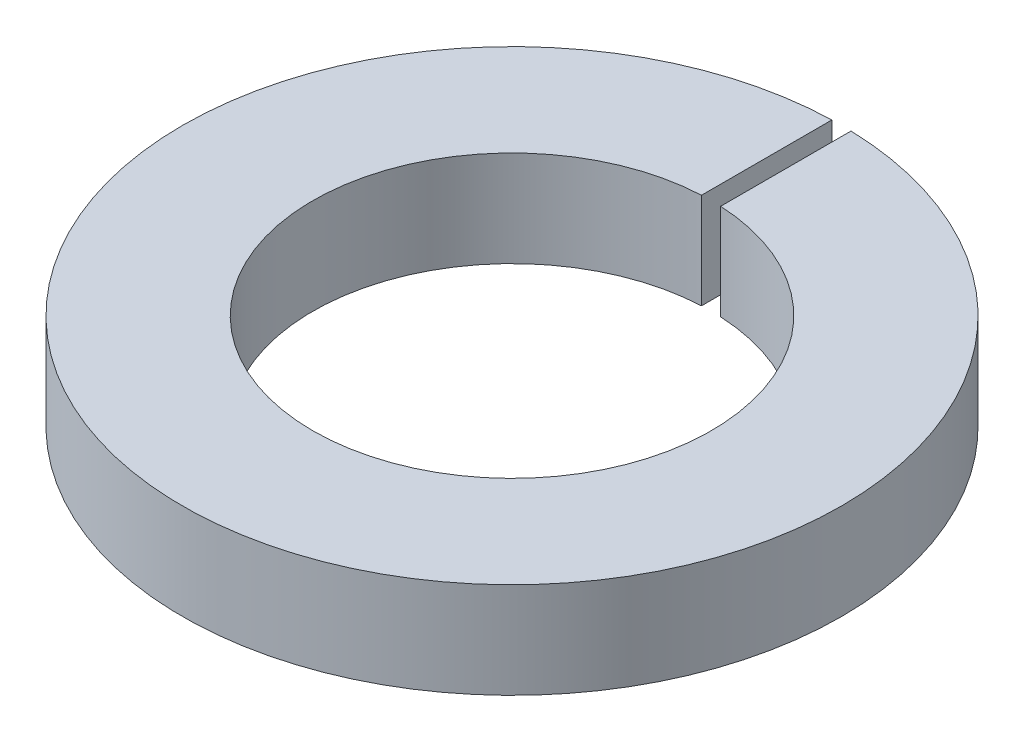
ISO-10303-21;
HEADER;
FILE_DESCRIPTION(('STEP AP214'),'2;1');
FILE_NAME('part.step','',(''),(''),'','','');
FILE_SCHEMA(('AUTOMOTIVE_DESIGN { 1 0 10303 214 1 1 1 1 }'));
ENDSEC;
DATA;
#1=APPLICATION_CONTEXT('core data for automotive mechanical design processes');
#2=APPLICATION_PROTOCOL_DEFINITION('international standard','automotive_design',2000,#1);
#3=PRODUCT_CONTEXT('',#1,'mechanical');
#4=PRODUCT('Part','Part','',(#3));
#5=PRODUCT_RELATED_PRODUCT_CATEGORY('part','',(#4));
#6=PRODUCT_DEFINITION_FORMATION('','',#4);
#7=PRODUCT_DEFINITION_CONTEXT('part definition',#1,'design');
#8=PRODUCT_DEFINITION('design','',#6,#7);
#9=PRODUCT_DEFINITION_SHAPE('','',#8);
#10=(LENGTH_UNIT() NAMED_UNIT(*) SI_UNIT(.MILLI.,.METRE.));
#11=(NAMED_UNIT(*) PLANE_ANGLE_UNIT() SI_UNIT($,.RADIAN.));
#12=(NAMED_UNIT(*) SI_UNIT($,.STERADIAN.) SOLID_ANGLE_UNIT());
#13=UNCERTAINTY_MEASURE_WITH_UNIT(LENGTH_MEASURE(1.E-05),#10,'distance_accuracy_value','');
#14=(GEOMETRIC_REPRESENTATION_CONTEXT(3) GLOBAL_UNCERTAINTY_ASSIGNED_CONTEXT((#13)) GLOBAL_UNIT_ASSIGNED_CONTEXT((#10,
#11,#12)) REPRESENTATION_CONTEXT('',''));
#15=CARTESIAN_POINT('',(0.,0.,0.));
#16=DIRECTION('',(0.,0.,1.));
#17=DIRECTION('',(1.,0.,0.));
#18=AXIS2_PLACEMENT_3D('',#15,#16,#17);
#19=CARTESIAN_POINT('',(0.,1.25,0.));
#20=DIRECTION('',(0.,-1.,0.));
#21=DIRECTION('',(0.,0.,1.));
#22=AXIS2_PLACEMENT_3D('',#19,#20,#21);
#23=CYLINDRICAL_SURFACE('',#22,4.3);
#24=CARTESIAN_POINT('',(0.,0.,0.));
#25=DIRECTION('',(0.,-1.,0.));
#26=DIRECTION('',(0.,0.,-1.));
#27=AXIS2_PLACEMENT_3D('',#24,#25,#26);
#28=CIRCLE('',#27,4.3);
#29=CARTESIAN_POINT('',(0.125,0.,-4.29818275553751));
#30=VERTEX_POINT('',#29);
#31=CARTESIAN_POINT('',(-0.125,0.,-4.29818275553751));
#32=VERTEX_POINT('',#31);
#33=EDGE_CURVE('E88',#30,#32,#28,.T.);
#34=ORIENTED_EDGE('',*,*,#33,.F.);
#35=DIRECTION('',(0.,-1.,0.));
#36=VECTOR('',#35,1.);
#37=CARTESIAN_POINT('',(0.125,1.25,-4.29818275553751));
#38=LINE('',#37,#36);
#39=CARTESIAN_POINT('',(0.125,1.25,-4.29818275553751));
#40=VERTEX_POINT('',#39);
#41=EDGE_CURVE('E79',#40,#30,#38,.T.);
#42=ORIENTED_EDGE('',*,*,#41,.F.);
#43=CARTESIAN_POINT('',(0.,1.25,0.));
#44=DIRECTION('',(0.,-1.,0.));
#45=DIRECTION('',(0.,0.,-1.));
#46=AXIS2_PLACEMENT_3D('',#43,#44,#45);
#47=CIRCLE('',#46,4.3);
#48=CARTESIAN_POINT('',(-0.125,1.25,-4.29818275553751));
#49=VERTEX_POINT('',#48);
#50=EDGE_CURVE('E74',#40,#49,#47,.T.);
#51=ORIENTED_EDGE('',*,*,#50,.T.);
#52=DIRECTION('',(0.,-1.,0.));
#53=VECTOR('',#52,1.);
#54=CARTESIAN_POINT('',(-0.125,1.25,-4.29818275553751));
#55=LINE('',#54,#53);
#56=EDGE_CURVE('E86',#32,#49,#55,.F.);
#57=ORIENTED_EDGE('',*,*,#56,.F.);
#58=EDGE_LOOP('',(#34,#42,#51,#57));
#59=FACE_BOUND('',#58,.T.);
#60=ADVANCED_FACE('F32',(#59),#23,.T.);
#61=CARTESIAN_POINT('',(0.,1.25,0.));
#62=DIRECTION('',(0.,1.,0.));
#63=DIRECTION('',(0.,0.,-1.));
#64=AXIS2_PLACEMENT_3D('',#61,#62,#63);
#65=PLANE('',#64);
#66=DIRECTION('',(0.,0.,1.));
#67=VECTOR('',#66,1.);
#68=CARTESIAN_POINT('',(-0.125,1.25,0.));
#69=LINE('',#68,#67);
#70=CARTESIAN_POINT('',(-0.125,1.25,-2.59699345397712));
#71=VERTEX_POINT('',#70);
#72=EDGE_CURVE('E99',#49,#71,#69,.T.);
#73=ORIENTED_EDGE('',*,*,#72,.F.);
#74=ORIENTED_EDGE('',*,*,#50,.F.);
#75=DIRECTION('',(0.,0.,-1.));
#76=VECTOR('',#75,1.);
#77=CARTESIAN_POINT('',(0.125,1.25,0.));
#78=LINE('',#77,#76);
#79=CARTESIAN_POINT('',(0.125,1.25,-2.59699345397712));
#80=VERTEX_POINT('',#79);
#81=EDGE_CURVE('E100',#80,#40,#78,.T.);
#82=ORIENTED_EDGE('',*,*,#81,.F.);
#83=CARTESIAN_POINT('',(0.,1.25,0.));
#84=DIRECTION('',(0.,-1.,0.));
#85=DIRECTION('',(0.,0.,-1.));
#86=AXIS2_PLACEMENT_3D('',#83,#84,#85);
#87=CIRCLE('',#86,2.6);
#88=EDGE_CURVE('E72',#80,#71,#87,.T.);
#89=ORIENTED_EDGE('',*,*,#88,.T.);
#90=EDGE_LOOP('',(#73,#74,#82,#89));
#91=FACE_BOUND('',#90,.T.);
#92=ADVANCED_FACE('F106',(#91),#65,.T.);
#93=CARTESIAN_POINT('',(0.,0.,0.));
#94=DIRECTION('',(0.,1.,0.));
#95=DIRECTION('',(0.,0.,-1.));
#96=AXIS2_PLACEMENT_3D('',#93,#94,#95);
#97=PLANE('',#96);
#98=CARTESIAN_POINT('',(0.,0.,0.));
#99=DIRECTION('',(0.,-1.,0.));
#100=DIRECTION('',(0.,0.,-1.));
#101=AXIS2_PLACEMENT_3D('',#98,#99,#100);
#102=CIRCLE('',#101,2.6);
#103=CARTESIAN_POINT('',(0.125,0.,-2.59699345397712));
#104=VERTEX_POINT('',#103);
#105=CARTESIAN_POINT('',(-0.125,0.,-2.59699345397712));
#106=VERTEX_POINT('',#105);
#107=EDGE_CURVE('E70',#104,#106,#102,.T.);
#108=ORIENTED_EDGE('',*,*,#107,.F.);
#109=DIRECTION('',(0.,0.,-1.));
#110=VECTOR('',#109,1.);
#111=CARTESIAN_POINT('',(0.125,0.,0.));
#112=LINE('',#111,#110);
#113=EDGE_CURVE('E76',#104,#30,#112,.T.);
#114=ORIENTED_EDGE('',*,*,#113,.T.);
#115=ORIENTED_EDGE('',*,*,#33,.T.);
#116=DIRECTION('',(0.,0.,1.));
#117=VECTOR('',#116,1.);
#118=CARTESIAN_POINT('',(-0.125,0.,0.));
#119=LINE('',#118,#117);
#120=EDGE_CURVE('E83',#32,#106,#119,.T.);
#121=ORIENTED_EDGE('',*,*,#120,.T.);
#122=EDGE_LOOP('',(#108,#114,#115,#121));
#123=FACE_BOUND('',#122,.T.);
#124=ADVANCED_FACE('F85',(#123),#97,.F.);
#125=CARTESIAN_POINT('',(0.,1.25,0.));
#126=DIRECTION('',(0.,-1.,0.));
#127=DIRECTION('',(0.,0.,1.));
#128=AXIS2_PLACEMENT_3D('',#125,#126,#127);
#129=CYLINDRICAL_SURFACE('',#128,2.6);
#130=DIRECTION('',(0.,-1.,0.));
#131=VECTOR('',#130,1.);
#132=CARTESIAN_POINT('',(-0.125,1.25,-2.59699345397712));
#133=LINE('',#132,#131);
#134=EDGE_CURVE('E11',#106,#71,#133,.F.);
#135=ORIENTED_EDGE('',*,*,#134,.T.);
#136=ORIENTED_EDGE('',*,*,#88,.F.);
#137=DIRECTION('',(0.,-1.,0.));
#138=VECTOR('',#137,1.);
#139=CARTESIAN_POINT('',(0.125,1.25,-2.59699345397712));
#140=LINE('',#139,#138);
#141=EDGE_CURVE('E39',#80,#104,#140,.T.);
#142=ORIENTED_EDGE('',*,*,#141,.T.);
#143=ORIENTED_EDGE('',*,*,#107,.T.);
#144=EDGE_LOOP('',(#135,#136,#142,#143));
#145=FACE_BOUND('',#144,.T.);
#146=ADVANCED_FACE('F68',(#145),#129,.F.);
#147=CARTESIAN_POINT('',(0.125,1.25,0.));
#148=DIRECTION('',(1.,0.,0.));
#149=DIRECTION('',(0.,0.,1.));
#150=AXIS2_PLACEMENT_3D('',#147,#148,#149);
#151=PLANE('',#150);
#152=ORIENTED_EDGE('',*,*,#81,.T.);
#153=ORIENTED_EDGE('',*,*,#41,.T.);
#154=ORIENTED_EDGE('',*,*,#113,.F.);
#155=ORIENTED_EDGE('',*,*,#141,.F.);
#156=EDGE_LOOP('',(#152,#153,#154,#155));
#157=FACE_BOUND('',#156,.T.);
#158=ADVANCED_FACE('F77',(#157),#151,.F.);
#159=CARTESIAN_POINT('',(-0.125,1.25,0.));
#160=DIRECTION('',(-1.,0.,0.));
#161=DIRECTION('',(0.,0.,-1.));
#162=AXIS2_PLACEMENT_3D('',#159,#160,#161);
#163=PLANE('',#162);
#164=ORIENTED_EDGE('',*,*,#120,.F.);
#165=ORIENTED_EDGE('',*,*,#56,.T.);
#166=ORIENTED_EDGE('',*,*,#72,.T.);
#167=ORIENTED_EDGE('',*,*,#134,.F.);
#168=EDGE_LOOP('',(#164,#165,#166,#167));
#169=FACE_BOUND('',#168,.T.);
#170=ADVANCED_FACE('F98',(#169),#163,.F.);
#171=CLOSED_SHELL('',(#60,#92,#124,#146,#158,#170));
#172=MANIFOLD_SOLID_BREP('B2',#171);
#173=ADVANCED_BREP_SHAPE_REPRESENTATION('',(#18,#172),#14);
#174=SHAPE_DEFINITION_REPRESENTATION(#9,#173);
ENDSEC;
END-ISO-10303-21;
